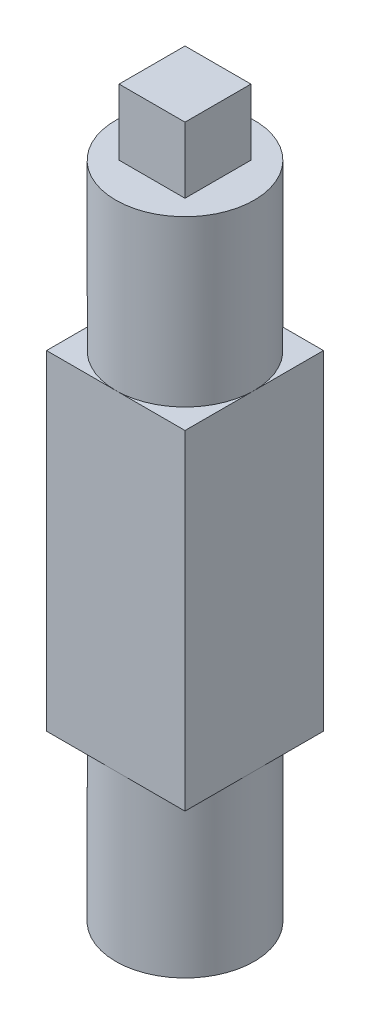
ISO-10303-21;
HEADER;
FILE_DESCRIPTION(('STEP AP214'),'2;1');
FILE_NAME('part.step','',(''),(''),'','','');
FILE_SCHEMA(('AUTOMOTIVE_DESIGN { 1 0 10303 214 1 1 1 1 }'));
ENDSEC;
DATA;
#1=APPLICATION_CONTEXT('core data for automotive mechanical design processes');
#2=APPLICATION_PROTOCOL_DEFINITION('international standard','automotive_design',2000,#1);
#3=PRODUCT_CONTEXT('',#1,'mechanical');
#4=PRODUCT('Part','Part','',(#3));
#5=PRODUCT_RELATED_PRODUCT_CATEGORY('part','',(#4));
#6=PRODUCT_DEFINITION_FORMATION('','',#4);
#7=PRODUCT_DEFINITION_CONTEXT('part definition',#1,'design');
#8=PRODUCT_DEFINITION('design','',#6,#7);
#9=PRODUCT_DEFINITION_SHAPE('','',#8);
#10=(LENGTH_UNIT() NAMED_UNIT(*) SI_UNIT(.MILLI.,.METRE.));
#11=(NAMED_UNIT(*) PLANE_ANGLE_UNIT() SI_UNIT($,.RADIAN.));
#12=(NAMED_UNIT(*) SI_UNIT($,.STERADIAN.) SOLID_ANGLE_UNIT());
#13=UNCERTAINTY_MEASURE_WITH_UNIT(LENGTH_MEASURE(1.E-05),#10,'distance_accuracy_value','');
#14=(GEOMETRIC_REPRESENTATION_CONTEXT(3) GLOBAL_UNCERTAINTY_ASSIGNED_CONTEXT((#13)) GLOBAL_UNIT_ASSIGNED_CONTEXT((#10,
#11,#12)) REPRESENTATION_CONTEXT('',''));
#15=CARTESIAN_POINT('',(0.,0.,0.));
#16=DIRECTION('',(0.,0.,1.));
#17=DIRECTION('',(1.,0.,0.));
#18=AXIS2_PLACEMENT_3D('',#15,#16,#17);
#19=CARTESIAN_POINT('',(0.,75.,0.));
#20=DIRECTION('',(0.,1.,0.));
#21=DIRECTION('',(0.,0.,1.));
#22=AXIS2_PLACEMENT_3D('',#19,#20,#21);
#23=PLANE('',#22);
#24=CARTESIAN_POINT('',(0.,75.,0.));
#25=DIRECTION('',(0.,1.,0.));
#26=DIRECTION('',(0.,0.,1.));
#27=AXIS2_PLACEMENT_3D('',#24,#25,#26);
#28=CIRCLE('',#27,10.5);
#29=CARTESIAN_POINT('',(0.,75.,10.5));
#30=VERTEX_POINT('',#29);
#31=CARTESIAN_POINT('',(10.5,75.,0.));
#32=VERTEX_POINT('',#31);
#33=EDGE_CURVE('E53',#30,#32,#28,.T.);
#34=ORIENTED_EDGE('',*,*,#33,.F.);
#35=DIRECTION('',(1.,0.,0.));
#36=VECTOR('',#35,1.);
#37=CARTESIAN_POINT('',(10.5,75.,10.5));
#38=LINE('',#37,#36);
#39=CARTESIAN_POINT('',(10.5,75.,10.5));
#40=VERTEX_POINT('',#39);
#41=EDGE_CURVE('E168',#30,#40,#38,.T.);
#42=ORIENTED_EDGE('',*,*,#41,.T.);
#43=DIRECTION('',(0.,0.,-1.));
#44=VECTOR('',#43,1.);
#45=CARTESIAN_POINT('',(10.5,75.,10.5));
#46=LINE('',#45,#44);
#47=EDGE_CURVE('E173',#40,#32,#46,.T.);
#48=ORIENTED_EDGE('',*,*,#47,.T.);
#49=EDGE_LOOP('',(#34,#42,#48));
#50=FACE_BOUND('',#49,.T.);
#51=ADVANCED_FACE('F37',(#50),#23,.T.);
#52=CARTESIAN_POINT('',(0.,75.,-10.5));
#53=VERTEX_POINT('',#52);
#54=EDGE_CURVE('E11',#32,#53,#28,.T.);
#55=ORIENTED_EDGE('',*,*,#54,.F.);
#56=CARTESIAN_POINT('',(10.5,75.,-10.5));
#57=VERTEX_POINT('',#56);
#58=EDGE_CURVE('E172',#32,#57,#46,.T.);
#59=ORIENTED_EDGE('',*,*,#58,.T.);
#60=DIRECTION('',(-1.,0.,0.));
#61=VECTOR('',#60,1.);
#62=CARTESIAN_POINT('',(10.5,75.,-10.5));
#63=LINE('',#62,#61);
#64=EDGE_CURVE('E177',#57,#53,#63,.T.);
#65=ORIENTED_EDGE('',*,*,#64,.T.);
#66=EDGE_LOOP('',(#55,#59,#65));
#67=FACE_BOUND('',#66,.T.);
#68=ADVANCED_FACE('F243',(#67),#23,.T.);
#69=CARTESIAN_POINT('',(-10.5,75.,0.));
#70=VERTEX_POINT('',#69);
#71=EDGE_CURVE('E51',#53,#70,#28,.T.);
#72=ORIENTED_EDGE('',*,*,#71,.F.);
#73=CARTESIAN_POINT('',(-10.5,75.,-10.5));
#74=VERTEX_POINT('',#73);
#75=EDGE_CURVE('E176',#53,#74,#63,.T.);
#76=ORIENTED_EDGE('',*,*,#75,.T.);
#77=DIRECTION('',(0.,0.,1.));
#78=VECTOR('',#77,1.);
#79=CARTESIAN_POINT('',(-10.5,75.,10.5));
#80=LINE('',#79,#78);
#81=EDGE_CURVE('E165',#74,#70,#80,.T.);
#82=ORIENTED_EDGE('',*,*,#81,.T.);
#83=EDGE_LOOP('',(#72,#76,#82));
#84=FACE_BOUND('',#83,.T.);
#85=ADVANCED_FACE('F250',(#84),#23,.T.);
#86=CARTESIAN_POINT('',(0.,25.,0.));
#87=DIRECTION('',(0.,-1.,0.));
#88=DIRECTION('',(0.,0.,-1.));
#89=AXIS2_PLACEMENT_3D('',#86,#87,#88);
#90=CYLINDRICAL_SURFACE('',#89,10.5);
#91=CARTESIAN_POINT('',(0.,25.,0.));
#92=DIRECTION('',(0.,1.,0.));
#93=DIRECTION('',(0.,0.,1.));
#94=AXIS2_PLACEMENT_3D('',#91,#92,#93);
#95=CIRCLE('',#94,10.5);
#96=CARTESIAN_POINT('',(0.,25.,10.5));
#97=VERTEX_POINT('',#96);
#98=CARTESIAN_POINT('',(10.5,25.,0.));
#99=VERTEX_POINT('',#98);
#100=EDGE_CURVE('E208',#97,#99,#95,.T.);
#101=ORIENTED_EDGE('',*,*,#100,.F.);
#102=CARTESIAN_POINT('',(-10.5,25.,0.));
#103=VERTEX_POINT('',#102);
#104=EDGE_CURVE('E212',#103,#97,#95,.T.);
#105=ORIENTED_EDGE('',*,*,#104,.F.);
#106=CARTESIAN_POINT('',(0.,25.,-10.5));
#107=VERTEX_POINT('',#106);
#108=EDGE_CURVE('E295',#107,#103,#95,.T.);
#109=ORIENTED_EDGE('',*,*,#108,.F.);
#110=EDGE_CURVE('E211',#99,#107,#95,.T.);
#111=ORIENTED_EDGE('',*,*,#110,.F.);
#112=EDGE_LOOP('',(#101,#105,#109,#111));
#113=FACE_BOUND('',#112,.T.);
#114=CARTESIAN_POINT('',(0.,0.,0.));
#115=DIRECTION('',(0.,1.,0.));
#116=DIRECTION('',(0.,0.,1.));
#117=AXIS2_PLACEMENT_3D('',#114,#115,#116);
#118=CIRCLE('',#117,10.5);
#119=CARTESIAN_POINT('',(0.,0.,10.5));
#120=VERTEX_POINT('',#119);
#121=EDGE_CURVE('E207',#120,#120,#118,.T.);
#122=ORIENTED_EDGE('',*,*,#121,.T.);
#123=EDGE_LOOP('',(#122));
#124=FACE_BOUND('',#123,.T.);
#125=ADVANCED_FACE('F39',(#113,#124),#90,.T.);
#126=CARTESIAN_POINT('',(0.,0.,0.));
#127=DIRECTION('',(0.,1.,0.));
#128=DIRECTION('',(0.,0.,1.));
#129=AXIS2_PLACEMENT_3D('',#126,#127,#128);
#130=PLANE('',#129);
#131=CARTESIAN_POINT('',(0.,0.,0.));
#132=DIRECTION('',(0.,-1.,0.));
#133=DIRECTION('',(0.,0.,-1.));
#134=AXIS2_PLACEMENT_3D('',#131,#132,#133);
#135=CIRCLE('',#134,6.5);
#136=CARTESIAN_POINT('',(0.,0.,-6.5));
#137=VERTEX_POINT('',#136);
#138=EDGE_CURVE('E572',#137,#137,#135,.T.);
#139=ORIENTED_EDGE('',*,*,#138,.F.);
#140=EDGE_LOOP('',(#139));
#141=FACE_BOUND('',#140,.T.);
#142=ORIENTED_EDGE('',*,*,#121,.F.);
#143=EDGE_LOOP('',(#142));
#144=FACE_BOUND('',#143,.T.);
#145=ADVANCED_FACE('F273',(#141,#144),#130,.F.);
#146=CARTESIAN_POINT('',(0.,25.,0.));
#147=DIRECTION('',(0.,1.,0.));
#148=DIRECTION('',(0.,0.,1.));
#149=AXIS2_PLACEMENT_3D('',#146,#147,#148);
#150=PLANE('',#149);
#151=DIRECTION('',(1.,0.,0.));
#152=VECTOR('',#151,1.);
#153=CARTESIAN_POINT('',(10.5,25.,10.5));
#154=LINE('',#153,#152);
#155=CARTESIAN_POINT('',(10.5,25.,10.5));
#156=VERTEX_POINT('',#155);
#157=EDGE_CURVE('E184',#97,#156,#154,.T.);
#158=ORIENTED_EDGE('',*,*,#157,.F.);
#159=ORIENTED_EDGE('',*,*,#100,.T.);
#160=DIRECTION('',(0.,0.,-1.));
#161=VECTOR('',#160,1.);
#162=CARTESIAN_POINT('',(10.5,25.,10.5));
#163=LINE('',#162,#161);
#164=EDGE_CURVE('E189',#156,#99,#163,.T.);
#165=ORIENTED_EDGE('',*,*,#164,.F.);
#166=EDGE_LOOP('',(#158,#159,#165));
#167=FACE_BOUND('',#166,.T.);
#168=ADVANCED_FACE('F311',(#167),#150,.F.);
#169=CARTESIAN_POINT('',(10.5,25.,-10.5));
#170=VERTEX_POINT('',#169);
#171=EDGE_CURVE('E188',#99,#170,#163,.T.);
#172=ORIENTED_EDGE('',*,*,#171,.F.);
#173=ORIENTED_EDGE('',*,*,#110,.T.);
#174=DIRECTION('',(-1.,0.,0.));
#175=VECTOR('',#174,1.);
#176=CARTESIAN_POINT('',(10.5,25.,-10.5));
#177=LINE('',#176,#175);
#178=EDGE_CURVE('E193',#170,#107,#177,.T.);
#179=ORIENTED_EDGE('',*,*,#178,.F.);
#180=EDGE_LOOP('',(#172,#173,#179));
#181=FACE_BOUND('',#180,.T.);
#182=ADVANCED_FACE('F293',(#181),#150,.F.);
#183=CARTESIAN_POINT('',(-10.5,25.,-10.5));
#184=VERTEX_POINT('',#183);
#185=EDGE_CURVE('E192',#107,#184,#177,.T.);
#186=ORIENTED_EDGE('',*,*,#185,.F.);
#187=ORIENTED_EDGE('',*,*,#108,.T.);
#188=DIRECTION('',(0.,0.,1.));
#189=VECTOR('',#188,1.);
#190=CARTESIAN_POINT('',(-10.5,25.,10.5));
#191=LINE('',#190,#189);
#192=EDGE_CURVE('E181',#184,#103,#191,.T.);
#193=ORIENTED_EDGE('',*,*,#192,.F.);
#194=EDGE_LOOP('',(#186,#187,#193));
#195=FACE_BOUND('',#194,.T.);
#196=ADVANCED_FACE('F299',(#195),#150,.F.);
#197=CARTESIAN_POINT('',(-10.5,25.,10.5));
#198=VERTEX_POINT('',#197);
#199=EDGE_CURVE('E163',#103,#198,#191,.T.);
#200=ORIENTED_EDGE('',*,*,#199,.F.);
#201=ORIENTED_EDGE('',*,*,#104,.T.);
#202=EDGE_CURVE('E185',#198,#97,#154,.T.);
#203=ORIENTED_EDGE('',*,*,#202,.F.);
#204=EDGE_LOOP('',(#200,#201,#203));
#205=FACE_BOUND('',#204,.T.);
#206=ADVANCED_FACE('F315',(#205),#150,.F.);
#207=CARTESIAN_POINT('',(-10.5,75.,10.5));
#208=DIRECTION('',(1.,0.,0.));
#209=DIRECTION('',(0.,0.,-1.));
#210=AXIS2_PLACEMENT_3D('',#207,#208,#209);
#211=PLANE('',#210);
#212=CARTESIAN_POINT('',(-10.5,56.2030928561839,0.));
#213=DIRECTION('',(-1.,0.,0.));
#214=DIRECTION('',(0.,0.,1.));
#215=AXIS2_PLACEMENT_3D('',#212,#213,#214);
#216=CIRCLE('',#215,4.);
#217=CARTESIAN_POINT('',(-10.5,56.2030928561839,4.));
#218=VERTEX_POINT('',#217);
#219=EDGE_CURVE('E552',#218,#218,#216,.T.);
#220=ORIENTED_EDGE('',*,*,#219,.F.);
#221=EDGE_LOOP('',(#220));
#222=FACE_BOUND('',#221,.T.);
#223=ORIENTED_EDGE('',*,*,#192,.T.);
#224=ORIENTED_EDGE('',*,*,#199,.T.);
#225=DIRECTION('',(0.,-1.,0.));
#226=VECTOR('',#225,1.);
#227=CARTESIAN_POINT('',(-10.5,75.,10.5));
#228=LINE('',#227,#226);
#229=CARTESIAN_POINT('',(-10.5,75.,10.5));
#230=VERTEX_POINT('',#229);
#231=EDGE_CURVE('E204',#230,#198,#228,.T.);
#232=ORIENTED_EDGE('',*,*,#231,.F.);
#233=EDGE_CURVE('E169',#70,#230,#80,.T.);
#234=ORIENTED_EDGE('',*,*,#233,.F.);
#235=ORIENTED_EDGE('',*,*,#81,.F.);
#236=DIRECTION('',(0.,-1.,0.));
#237=VECTOR('',#236,1.);
#238=CARTESIAN_POINT('',(-10.5,75.,-10.5));
#239=LINE('',#238,#237);
#240=EDGE_CURVE('E180',#74,#184,#239,.T.);
#241=ORIENTED_EDGE('',*,*,#240,.T.);
#242=EDGE_LOOP('',(#223,#224,#232,#234,#235,#241));
#243=FACE_BOUND('',#242,.T.);
#244=ADVANCED_FACE('F302',(#222,#243),#211,.F.);
#245=CARTESIAN_POINT('',(10.5,75.,10.5));
#246=DIRECTION('',(0.,0.,-1.));
#247=DIRECTION('',(-1.,0.,0.));
#248=AXIS2_PLACEMENT_3D('',#245,#246,#247);
#249=PLANE('',#248);
#250=ORIENTED_EDGE('',*,*,#202,.T.);
#251=ORIENTED_EDGE('',*,*,#157,.T.);
#252=DIRECTION('',(0.,-1.,0.));
#253=VECTOR('',#252,1.);
#254=CARTESIAN_POINT('',(10.5,75.,10.5));
#255=LINE('',#254,#253);
#256=EDGE_CURVE('E201',#40,#156,#255,.T.);
#257=ORIENTED_EDGE('',*,*,#256,.F.);
#258=ORIENTED_EDGE('',*,*,#41,.F.);
#259=EDGE_CURVE('E170',#230,#30,#38,.T.);
#260=ORIENTED_EDGE('',*,*,#259,.F.);
#261=ORIENTED_EDGE('',*,*,#231,.T.);
#262=EDGE_LOOP('',(#250,#251,#257,#258,#260,#261));
#263=FACE_BOUND('',#262,.T.);
#264=ADVANCED_FACE('F307',(#263),#249,.F.);
#265=CARTESIAN_POINT('',(10.5,75.,10.5));
#266=DIRECTION('',(-1.,0.,0.));
#267=DIRECTION('',(0.,0.,1.));
#268=AXIS2_PLACEMENT_3D('',#265,#266,#267);
#269=PLANE('',#268);
#270=ORIENTED_EDGE('',*,*,#164,.T.);
#271=ORIENTED_EDGE('',*,*,#171,.T.);
#272=DIRECTION('',(0.,-1.,0.));
#273=VECTOR('',#272,1.);
#274=CARTESIAN_POINT('',(10.5,75.,-10.5));
#275=LINE('',#274,#273);
#276=EDGE_CURVE('E198',#57,#170,#275,.T.);
#277=ORIENTED_EDGE('',*,*,#276,.F.);
#278=ORIENTED_EDGE('',*,*,#58,.F.);
#279=ORIENTED_EDGE('',*,*,#47,.F.);
#280=ORIENTED_EDGE('',*,*,#256,.T.);
#281=EDGE_LOOP('',(#270,#271,#277,#278,#279,#280));
#282=FACE_BOUND('',#281,.T.);
#283=ADVANCED_FACE('F265',(#282),#269,.F.);
#284=CARTESIAN_POINT('',(10.5,75.,-10.5));
#285=DIRECTION('',(0.,0.,1.));
#286=DIRECTION('',(1.,0.,0.));
#287=AXIS2_PLACEMENT_3D('',#284,#285,#286);
#288=PLANE('',#287);
#289=ORIENTED_EDGE('',*,*,#178,.T.);
#290=ORIENTED_EDGE('',*,*,#185,.T.);
#291=ORIENTED_EDGE('',*,*,#240,.F.);
#292=ORIENTED_EDGE('',*,*,#75,.F.);
#293=ORIENTED_EDGE('',*,*,#64,.F.);
#294=ORIENTED_EDGE('',*,*,#276,.T.);
#295=EDGE_LOOP('',(#289,#290,#291,#292,#293,#294));
#296=FACE_BOUND('',#295,.T.);
#297=ADVANCED_FACE('F257',(#296),#288,.F.);
#298=EDGE_CURVE('E157',#70,#30,#28,.T.);
#299=ORIENTED_EDGE('',*,*,#298,.F.);
#300=ORIENTED_EDGE('',*,*,#233,.T.);
#301=ORIENTED_EDGE('',*,*,#259,.T.);
#302=EDGE_LOOP('',(#299,#300,#301));
#303=FACE_BOUND('',#302,.T.);
#304=ADVANCED_FACE('F246',(#303),#23,.T.);
#305=CARTESIAN_POINT('',(0.,100.,0.));
#306=DIRECTION('',(0.,-1.,0.));
#307=DIRECTION('',(0.,0.,-1.));
#308=AXIS2_PLACEMENT_3D('',#305,#306,#307);
#309=CYLINDRICAL_SURFACE('',#308,10.5);
#310=CARTESIAN_POINT('',(0.,100.,0.));
#311=DIRECTION('',(0.,1.,0.));
#312=DIRECTION('',(0.,0.,1.));
#313=AXIS2_PLACEMENT_3D('',#310,#311,#312);
#314=CIRCLE('',#313,10.5);
#315=CARTESIAN_POINT('',(0.,100.,10.5));
#316=VERTEX_POINT('',#315);
#317=EDGE_CURVE('E156',#316,#316,#314,.T.);
#318=ORIENTED_EDGE('',*,*,#317,.F.);
#319=EDGE_LOOP('',(#318));
#320=FACE_BOUND('',#319,.T.);
#321=ORIENTED_EDGE('',*,*,#33,.T.);
#322=ORIENTED_EDGE('',*,*,#54,.T.);
#323=ORIENTED_EDGE('',*,*,#71,.T.);
#324=ORIENTED_EDGE('',*,*,#298,.T.);
#325=EDGE_LOOP('',(#321,#322,#323,#324));
#326=FACE_BOUND('',#325,.T.);
#327=ADVANCED_FACE('F256',(#320,#326),#309,.T.);
#328=CARTESIAN_POINT('',(0.,100.,0.));
#329=DIRECTION('',(0.,1.,0.));
#330=DIRECTION('',(0.,0.,1.));
#331=AXIS2_PLACEMENT_3D('',#328,#329,#330);
#332=PLANE('',#331);
#333=DIRECTION('',(0.,0.,-1.));
#334=VECTOR('',#333,1.);
#335=CARTESIAN_POINT('',(5.,100.,-5.));
#336=LINE('',#335,#334);
#337=CARTESIAN_POINT('',(5.,100.,5.));
#338=VERTEX_POINT('',#337);
#339=CARTESIAN_POINT('',(5.,100.,-5.));
#340=VERTEX_POINT('',#339);
#341=EDGE_CURVE('E60',#338,#340,#336,.T.);
#342=ORIENTED_EDGE('',*,*,#341,.F.);
#343=DIRECTION('',(1.,0.,0.));
#344=VECTOR('',#343,1.);
#345=CARTESIAN_POINT('',(-5.,100.,5.));
#346=LINE('',#345,#344);
#347=CARTESIAN_POINT('',(-5.,100.,5.));
#348=VERTEX_POINT('',#347);
#349=EDGE_CURVE('E64',#348,#338,#346,.T.);
#350=ORIENTED_EDGE('',*,*,#349,.F.);
#351=DIRECTION('',(0.,0.,1.));
#352=VECTOR('',#351,1.);
#353=CARTESIAN_POINT('',(-5.,100.,-5.));
#354=LINE('',#353,#352);
#355=CARTESIAN_POINT('',(-5.,100.,-5.));
#356=VERTEX_POINT('',#355);
#357=EDGE_CURVE('E565',#356,#348,#354,.T.);
#358=ORIENTED_EDGE('',*,*,#357,.F.);
#359=DIRECTION('',(-1.,0.,0.));
#360=VECTOR('',#359,1.);
#361=CARTESIAN_POINT('',(-5.,100.,-5.));
#362=LINE('',#361,#360);
#363=EDGE_CURVE('E563',#340,#356,#362,.T.);
#364=ORIENTED_EDGE('',*,*,#363,.F.);
#365=EDGE_LOOP('',(#342,#350,#358,#364));
#366=FACE_BOUND('',#365,.T.);
#367=ORIENTED_EDGE('',*,*,#317,.T.);
#368=EDGE_LOOP('',(#367));
#369=FACE_BOUND('',#368,.T.);
#370=ADVANCED_FACE('F263',(#366,#369),#332,.T.);
#371=CARTESIAN_POINT('',(5.,110.,-5.));
#372=DIRECTION('',(-1.,0.,0.));
#373=DIRECTION('',(0.,0.,1.));
#374=AXIS2_PLACEMENT_3D('',#371,#372,#373);
#375=PLANE('',#374);
#376=ORIENTED_EDGE('',*,*,#341,.T.);
#377=DIRECTION('',(0.,-1.,0.));
#378=VECTOR('',#377,1.);
#379=CARTESIAN_POINT('',(5.,110.,-5.));
#380=LINE('',#379,#378);
#381=CARTESIAN_POINT('',(5.,110.,-5.));
#382=VERTEX_POINT('',#381);
#383=EDGE_CURVE('E137',#382,#340,#380,.T.);
#384=ORIENTED_EDGE('',*,*,#383,.F.);
#385=DIRECTION('',(0.,0.,-1.));
#386=VECTOR('',#385,1.);
#387=CARTESIAN_POINT('',(5.,110.,-5.));
#388=LINE('',#387,#386);
#389=CARTESIAN_POINT('',(5.,110.,5.));
#390=VERTEX_POINT('',#389);
#391=EDGE_CURVE('E143',#390,#382,#388,.T.);
#392=ORIENTED_EDGE('',*,*,#391,.F.);
#393=DIRECTION('',(0.,-1.,0.));
#394=VECTOR('',#393,1.);
#395=CARTESIAN_POINT('',(5.,110.,5.));
#396=LINE('',#395,#394);
#397=EDGE_CURVE('E561',#390,#338,#396,.T.);
#398=ORIENTED_EDGE('',*,*,#397,.T.);
#399=EDGE_LOOP('',(#376,#384,#392,#398));
#400=FACE_BOUND('',#399,.T.);
#401=ADVANCED_FACE('F153',(#400),#375,.F.);
#402=CARTESIAN_POINT('',(-5.,110.,-5.));
#403=DIRECTION('',(0.,0.,1.));
#404=DIRECTION('',(1.,0.,0.));
#405=AXIS2_PLACEMENT_3D('',#402,#403,#404);
#406=PLANE('',#405);
#407=ORIENTED_EDGE('',*,*,#363,.T.);
#408=DIRECTION('',(0.,-1.,0.));
#409=VECTOR('',#408,1.);
#410=CARTESIAN_POINT('',(-5.,110.,-5.));
#411=LINE('',#410,#409);
#412=CARTESIAN_POINT('',(-5.,110.,-5.));
#413=VERTEX_POINT('',#412);
#414=EDGE_CURVE('E139',#413,#356,#411,.T.);
#415=ORIENTED_EDGE('',*,*,#414,.F.);
#416=DIRECTION('',(-1.,0.,0.));
#417=VECTOR('',#416,1.);
#418=CARTESIAN_POINT('',(-5.,110.,-5.));
#419=LINE('',#418,#417);
#420=EDGE_CURVE('E132',#382,#413,#419,.T.);
#421=ORIENTED_EDGE('',*,*,#420,.F.);
#422=ORIENTED_EDGE('',*,*,#383,.T.);
#423=EDGE_LOOP('',(#407,#415,#421,#422));
#424=FACE_BOUND('',#423,.T.);
#425=ADVANCED_FACE('F135',(#424),#406,.F.);
#426=CARTESIAN_POINT('',(-5.,110.,-5.));
#427=DIRECTION('',(1.,0.,0.));
#428=DIRECTION('',(0.,0.,-1.));
#429=AXIS2_PLACEMENT_3D('',#426,#427,#428);
#430=PLANE('',#429);
#431=ORIENTED_EDGE('',*,*,#357,.T.);
#432=DIRECTION('',(0.,-1.,0.));
#433=VECTOR('',#432,1.);
#434=CARTESIAN_POINT('',(-5.,110.,5.));
#435=LINE('',#434,#433);
#436=CARTESIAN_POINT('',(-5.,110.,5.));
#437=VERTEX_POINT('',#436);
#438=EDGE_CURVE('E158',#437,#348,#435,.T.);
#439=ORIENTED_EDGE('',*,*,#438,.F.);
#440=DIRECTION('',(0.,0.,1.));
#441=VECTOR('',#440,1.);
#442=CARTESIAN_POINT('',(-5.,110.,-5.));
#443=LINE('',#442,#441);
#444=EDGE_CURVE('E142',#413,#437,#443,.T.);
#445=ORIENTED_EDGE('',*,*,#444,.F.);
#446=ORIENTED_EDGE('',*,*,#414,.T.);
#447=EDGE_LOOP('',(#431,#439,#445,#446));
#448=FACE_BOUND('',#447,.T.);
#449=ADVANCED_FACE('F387',(#448),#430,.F.);
#450=CARTESIAN_POINT('',(-5.,110.,5.));
#451=DIRECTION('',(0.,0.,-1.));
#452=DIRECTION('',(-1.,0.,0.));
#453=AXIS2_PLACEMENT_3D('',#450,#451,#452);
#454=PLANE('',#453);
#455=ORIENTED_EDGE('',*,*,#349,.T.);
#456=ORIENTED_EDGE('',*,*,#397,.F.);
#457=DIRECTION('',(1.,0.,0.));
#458=VECTOR('',#457,1.);
#459=CARTESIAN_POINT('',(-5.,110.,5.));
#460=LINE('',#459,#458);
#461=EDGE_CURVE('E148',#437,#390,#460,.T.);
#462=ORIENTED_EDGE('',*,*,#461,.F.);
#463=ORIENTED_EDGE('',*,*,#438,.T.);
#464=EDGE_LOOP('',(#455,#456,#462,#463));
#465=FACE_BOUND('',#464,.T.);
#466=ADVANCED_FACE('F397',(#465),#454,.F.);
#467=CARTESIAN_POINT('',(0.,110.,0.));
#468=DIRECTION('',(0.,1.,0.));
#469=DIRECTION('',(0.,0.,1.));
#470=AXIS2_PLACEMENT_3D('',#467,#468,#469);
#471=PLANE('',#470);
#472=ORIENTED_EDGE('',*,*,#391,.T.);
#473=ORIENTED_EDGE('',*,*,#420,.T.);
#474=ORIENTED_EDGE('',*,*,#444,.T.);
#475=ORIENTED_EDGE('',*,*,#461,.T.);
#476=EDGE_LOOP('',(#472,#473,#474,#475));
#477=FACE_BOUND('',#476,.T.);
#478=ADVANCED_FACE('F146',(#477),#471,.T.);
#479=CARTESIAN_POINT('',(7.5,56.2030928561839,0.));
#480=DIRECTION('',(-1.,0.,0.));
#481=DIRECTION('',(0.,0.,1.));
#482=AXIS2_PLACEMENT_3D('',#479,#480,#481);
#483=CYLINDRICAL_SURFACE('',#482,4.);
#484=CARTESIAN_POINT('',(-5.1234753829798,56.2030928561839,4.));
#485=CARTESIAN_POINT('',(-5.12347713657616,56.10324955332,3.99999887511368));
#486=CARTESIAN_POINT('',(-5.12640682483417,56.0033786467201,3.99625399732967));
#487=CARTESIAN_POINT('',(-5.13799719570292,55.8044844932012,3.98134025862972));
#488=CARTESIAN_POINT('',(-5.1466615873077,55.7054618369115,3.97016659302751));
#489=CARTESIAN_POINT('',(-5.16936573069826,55.5089102744308,3.9405590608807));
#490=CARTESIAN_POINT('',(-5.18341719303693,55.4113851072791,3.92210937501391));
#491=CARTESIAN_POINT('',(-5.21631619694594,55.2187221733228,3.87824609249435));
#492=CARTESIAN_POINT('',(-5.2351661198617,55.123585617751,3.85282903764331));
#493=CARTESIAN_POINT('',(-5.2975118930577,54.8443078177555,3.76713981429484));
#494=CARTESIAN_POINT('',(-5.34704541637303,54.6644051307186,3.69713461531885));
#495=CARTESIAN_POINT('',(-5.45637608486704,54.3192207026518,3.53377707470374));
#496=CARTESIAN_POINT('',(-5.51617292067096,54.1539385211327,3.44042543677516));
#497=CARTESIAN_POINT('',(-5.6486519372425,53.8190019218335,3.21892377258575));
#498=CARTESIAN_POINT('',(-5.72199980218117,53.6515554853992,3.08783223309545));
#499=CARTESIAN_POINT('',(-5.86799191617871,53.3391055063366,2.80046904719544));
#500=CARTESIAN_POINT('',(-5.94063551475959,53.1941211449764,2.64417611016676));
#501=CARTESIAN_POINT('',(-6.0483243275859,52.9881038282925,2.38286990663015));
#502=CARTESIAN_POINT('',(-6.08580938951634,52.9182669807567,2.28568158855732));
#503=CARTESIAN_POINT('',(-6.15757848162021,52.7871317213246,2.08461055875056));
#504=CARTESIAN_POINT('',(-6.19186384772521,52.7258297406595,1.98073067176673));
#505=CARTESIAN_POINT('',(-6.2562444343275,52.6124425730208,1.76688192807704));
#506=CARTESIAN_POINT('',(-6.28634164261803,52.5603530104253,1.65691599482345));
#507=CARTESIAN_POINT('',(-6.34144803942563,52.4660581624784,1.43159946565468));
#508=CARTESIAN_POINT('',(-6.36645811806669,52.4238511477258,1.31624981610915));
#509=CARTESIAN_POINT('',(-6.40838703250716,52.3536598681407,1.09278967074767));
#510=CARTESIAN_POINT('',(-6.42586235547201,52.3246801420343,0.985095920594979));
#511=CARTESIAN_POINT('',(-6.45552932860006,52.2757223477537,0.766973793679366));
#512=CARTESIAN_POINT('',(-6.46772182283343,52.2557428415384,0.656545856757165));
#513=CARTESIAN_POINT('',(-6.48645425113834,52.2251240924583,0.434014676552619));
#514=CARTESIAN_POINT('',(-6.49299865161971,52.2144774692144,0.321912828470643));
#515=CARTESIAN_POINT('',(-6.50024913730255,52.2026852675802,0.0970285709890167));
#516=CARTESIAN_POINT('',(-6.50095586344691,52.2015386461445,-0.0157537623365432));
#517=CARTESIAN_POINT('',(-6.49680097681437,52.2082926945523,-0.226182592153619));
#518=CARTESIAN_POINT('',(-6.49265447843572,52.2150314371297,-0.323882323128414));
#519=CARTESIAN_POINT('',(-6.48003989038484,52.235602805768,-0.518258298369308));
#520=CARTESIAN_POINT('',(-6.47157050163652,52.2494375642659,-0.614934226051797));
#521=CARTESIAN_POINT('',(-6.43993788468158,52.3013498353232,-0.902326020411395));
#522=CARTESIAN_POINT('',(-6.41054580962105,52.3498420503661,-1.09060145777752));
#523=CARTESIAN_POINT('',(-6.33753263883013,52.472577842377,-1.45625882265054));
#524=CARTESIAN_POINT('',(-6.29385686120839,52.5469204519535,-1.63359572328175));
#525=CARTESIAN_POINT('',(-6.19570063444803,52.7186037761612,-1.9734742197741));
#526=CARTESIAN_POINT('',(-6.14121759534825,52.8159500046837,-2.13601225543652));
#527=CARTESIAN_POINT('',(-6.01811329340775,53.0442860248484,-2.46301792903409));
#528=CARTESIAN_POINT('',(-5.94857761116338,53.1779372625278,-2.62527932595506));
#529=CARTESIAN_POINT('',(-5.80633337570436,53.4682196022893,-2.92648326267955));
#530=CARTESIAN_POINT('',(-5.73362042679609,53.6248832974537,-3.06539211925788));
#531=CARTESIAN_POINT('',(-5.58247201496418,53.9798105502089,-3.33354274624901));
#532=CARTESIAN_POINT('',(-5.50445614718878,54.1808259782625,-3.45941006662978));
#533=CARTESIAN_POINT('',(-5.36292828124606,54.6059612380331,-3.67501039724317));
#534=CARTESIAN_POINT('',(-5.29938954688106,54.8300373516208,-3.76481025437048));
#535=CARTESIAN_POINT('',(-5.2111969568149,55.2360917644402,-3.88555185537444));
#536=CARTESIAN_POINT('',(-5.18074475085953,55.4140702798468,-3.92569222311964));
#537=CARTESIAN_POINT('',(-5.13813041921935,55.7758978753792,-3.98131827949251));
#538=CARTESIAN_POINT('',(-5.12594478044201,55.9597390968803,-3.99683566482825));
#539=CARTESIAN_POINT('',(-5.12168600082458,56.3283926572449,-4.00229325003938));
#540=CARTESIAN_POINT('',(-5.12965141888962,56.5132061815947,-3.99218441424513));
#541=CARTESIAN_POINT('',(-5.16453073692964,56.8779599447115,-3.9469473814774));
#542=CARTESIAN_POINT('',(-5.19146010573793,57.0578960804905,-3.9117987593589));
#543=CARTESIAN_POINT('',(-5.26018225750345,57.4066455769126,-3.81886572423089));
#544=CARTESIAN_POINT('',(-5.30181972845391,57.5755541054622,-3.76131722200471));
#545=CARTESIAN_POINT('',(-5.3954670297872,57.9017786280099,-3.62570220427766));
#546=CARTESIAN_POINT('',(-5.44748061653257,58.0590903954188,-3.54762825488917));
#547=CARTESIAN_POINT('',(-5.56773730356901,58.3888431877168,-3.35638015591539));
#548=CARTESIAN_POINT('',(-5.6371970970822,58.5586210107212,-3.23937361019164));
#549=CARTESIAN_POINT('',(-5.7779144213707,58.8779494781105,-2.98117533428058));
#550=CARTESIAN_POINT('',(-5.84917370734001,59.0274793915443,-2.83995914704197));
#551=CARTESIAN_POINT('',(-5.99792993480129,59.3246447627804,-2.51230294955814));
#552=CARTESIAN_POINT('',(-6.07478576966285,59.4687139273129,-2.32226223380833));
#553=CARTESIAN_POINT('',(-6.17981341127997,59.6589355649869,-2.01780081268138));
#554=CARTESIAN_POINT('',(-6.21312570303109,59.718049452039,-1.91302977376878));
#555=CARTESIAN_POINT('',(-6.27541066154967,59.8270115580475,-1.69757398668656));
#556=CARTESIAN_POINT('',(-6.30438605831685,59.8768656107114,-1.58689301876127));
#557=CARTESIAN_POINT('',(-6.35540596966367,59.9637225765415,-1.36771717286114));
#558=CARTESIAN_POINT('',(-6.37777789582193,60.0013488224164,-1.25954523414218));
#559=CARTESIAN_POINT('',(-6.41730693921316,60.0673557926369,-1.0395424276752));
#560=CARTESIAN_POINT('',(-6.43446703905276,60.0957418056224,-0.927713693370161));
#561=CARTESIAN_POINT('',(-6.46305144652246,60.1428115619159,-0.70140168691385));
#562=CARTESIAN_POINT('',(-6.47448031829465,60.1615030260189,-0.58692060325831));
#563=CARTESIAN_POINT('',(-6.49125430740733,60.1888802155943,-0.356332076611583));
#564=CARTESIAN_POINT('',(-6.49660034488408,60.1975674543851,-0.24022488228897));
#565=CARTESIAN_POINT('',(-6.50072100810798,60.204264787696,-0.0241800032833929));
#566=CARTESIAN_POINT('',(-6.50032377647171,60.2036204158872,0.0757032145151782));
#567=CARTESIAN_POINT('',(-6.49494349113715,60.1948723073999,0.27505117774269));
#568=CARTESIAN_POINT('',(-6.48995903188888,60.1867662844331,0.374515785523161));
#569=CARTESIAN_POINT('',(-6.47552310051639,60.1632048557722,0.572201216464004));
#570=CARTESIAN_POINT('',(-6.46607350299796,60.1477525342691,0.670422543840654));
#571=CARTESIAN_POINT('',(-6.44293674493903,60.1097098626287,0.864977871596926));
#572=CARTESIAN_POINT('',(-6.42924794861747,60.0871167570053,0.961311128142403));
#573=CARTESIAN_POINT('',(-6.38312478202401,60.0104484725767,1.24124770417761));
#574=CARTESIAN_POINT('',(-6.34519014963781,59.9467829939158,1.42142818690046));
#575=CARTESIAN_POINT('',(-6.25739870433962,59.7959717950051,1.76836086933044));
#576=CARTESIAN_POINT('',(-6.20753967818403,59.7088217154824,1.93511056850881));
#577=CARTESIAN_POINT('',(-6.09366985599603,59.5032316538095,2.26971440354609));
#578=CARTESIAN_POINT('',(-6.02871907904727,59.3824537690492,2.43581096412528));
#579=CARTESIAN_POINT('',(-5.89363170045022,59.1181923886361,2.74661627133292));
#580=CARTESIAN_POINT('',(-5.82348918099978,58.9746827631193,2.89130002938076));
#581=CARTESIAN_POINT('',(-5.67394446001722,58.6460356724433,3.17577814197269));
#582=CARTESIAN_POINT('',(-5.59459938435395,58.4578867301595,3.31214609552206));
#583=CARTESIAN_POINT('',(-5.44573530175625,58.057920631607,3.5515999648683));
#584=CARTESIAN_POINT('',(-5.37620966590185,57.8461196170467,3.65470839450382));
#585=CARTESIAN_POINT('',(-5.27084090224943,57.4517851469061,3.80456746957854));
#586=CARTESIAN_POINT('',(-5.23094618875543,57.2732059018638,3.85875009839216));
#587=CARTESIAN_POINT('',(-5.18416897638833,56.9991697996227,3.92110216574551));
#588=CARTESIAN_POINT('',(-5.17076120978012,56.9068954812085,3.9387240346589));
#589=CARTESIAN_POINT('',(-5.1487383288086,56.7207937105988,3.96747159089492));
#590=CARTESIAN_POINT('',(-5.14012053111059,56.6269671583624,3.97860091550645));
#591=CARTESIAN_POINT('',(-5.13055281063194,56.4779835493844,3.99092178272306));
#592=CARTESIAN_POINT('',(-5.12790291115791,56.423104017453,3.99432349889887));
#593=CARTESIAN_POINT('',(-5.12436353114302,56.3131834269974,3.99886315266007));
#594=CARTESIAN_POINT('',(-5.12347441611905,56.2581423373102,4.00000062021594));
#595=CARTESIAN_POINT('',(-5.1234753829798,56.2030928561839,4.));
#596=B_SPLINE_CURVE_WITH_KNOTS('',3,(#484,#485,#486,#487,#488,#489,#490,#491,#492,#493,#494,
#495,#496,#497,#498,#499,#500,#501,#502,#503,#504,#505,#506,#507,#508,#509,#510,#511,#512,#513,
#514,#515,#516,#517,#518,#519,#520,#521,#522,#523,#524,#525,#526,#527,#528,#529,#530,#531,#532,
#533,#534,#535,#536,#537,#538,#539,#540,#541,#542,#543,#544,#545,#546,#547,#548,#549,#550,#551,
#552,#553,#554,#555,#556,#557,#558,#559,#560,#561,#562,#563,#564,#565,#566,#567,#568,#569,#570,
#571,#572,#573,#574,#575,#576,#577,#578,#579,#580,#581,#582,#583,#584,#585,#586,#587,#588,#589,
#590,#591,#592,#593,#594,#595),.UNSPECIFIED.,.T.,.F.,(4,2,2,2,2,2,2,2,2,2,2,2,2,2,2,2,2,2,2,2,2,
2,2,2,2,2,2,2,2,2,2,2,2,2,2,2,2,2,2,2,2,2,2,2,2,2,2,2,2,2,2,2,2,2,2,4),(0.,0.299465847023183,
0.599125566991792,0.899440422782909,1.1999046082103,1.79511322524675,2.39030390361143,
3.06260834820437,3.73548377320048,4.11128507027529,4.48692875482605,4.86239353791694,
5.23779256717747,5.5759578835789,5.91406914927767,6.25191279710496,6.58971935115932,
6.88341191371048,7.17719278611444,7.76417492115995,8.35343101568564,8.94282849646918,
9.60448206829833,10.2670819563898,11.0124413384164,11.7564128362636,12.3089912060134,
12.8608576731458,13.413780931277,13.9671557303272,14.5148536725638,15.0627502534703,
15.7129948273108,16.3639002039921,17.1112891013322,17.4853137026704,17.8591018628049,
18.2086733445076,18.5580443960154,18.9071367774896,19.2561763455443,19.5554587988362,
19.8548329843429,20.1540815946503,20.4534458203018,21.0352824358616,21.6172271279354,
22.2608757283334,22.9052696372282,23.6385367813605,24.3713065199459,24.9412520597774,
25.2256353387176,25.5098591455138,25.6749380032628,25.840051125734),.UNSPECIFIED.);
#597=CARTESIAN_POINT('',(-5.1234753829798,56.2030928561839,4.));
#598=VERTEX_POINT('',#597);
#599=EDGE_CURVE('E214',#598,#598,#596,.T.);
#600=ORIENTED_EDGE('',*,*,#599,.T.);
#601=EDGE_LOOP('',(#600));
#602=FACE_BOUND('',#601,.T.);
#603=ORIENTED_EDGE('',*,*,#219,.T.);
#604=EDGE_LOOP('',(#603));
#605=FACE_BOUND('',#604,.T.);
#606=ADVANCED_FACE('F220',(#602,#605),#483,.F.);
#607=CARTESIAN_POINT('',(0.,65.,0.));
#608=DIRECTION('',(0.,-1.,0.));
#609=DIRECTION('',(0.,0.,-1.));
#610=AXIS2_PLACEMENT_3D('',#607,#608,#609);
#611=CYLINDRICAL_SURFACE('',#610,6.5);
#612=ORIENTED_EDGE('',*,*,#599,.F.);
#613=EDGE_LOOP('',(#612));
#614=FACE_BOUND('',#613,.T.);
#615=CARTESIAN_POINT('',(0.,65.,0.));
#616=DIRECTION('',(0.,-1.,0.));
#617=DIRECTION('',(0.,0.,-1.));
#618=AXIS2_PLACEMENT_3D('',#615,#616,#617);
#619=CIRCLE('',#618,6.5);
#620=CARTESIAN_POINT('',(0.,65.,-6.5));
#621=VERTEX_POINT('',#620);
#622=EDGE_CURVE('E219',#621,#621,#619,.T.);
#623=ORIENTED_EDGE('',*,*,#622,.F.);
#624=EDGE_LOOP('',(#623));
#625=FACE_BOUND('',#624,.T.);
#626=ORIENTED_EDGE('',*,*,#138,.T.);
#627=EDGE_LOOP('',(#626));
#628=FACE_BOUND('',#627,.T.);
#629=CARTESIAN_POINT('',(5.1234753829798,56.2030928561839,4.));
#630=CARTESIAN_POINT('',(5.12347713657616,56.3029361590477,3.99999887511368));
#631=CARTESIAN_POINT('',(5.12640682483417,56.4028070656476,3.99625399732967));
#632=CARTESIAN_POINT('',(5.13799719570292,56.6017012191666,3.98134025862972));
#633=CARTESIAN_POINT('',(5.1466615873077,56.7007238754562,3.97016659302751));
#634=CARTESIAN_POINT('',(5.16936573069826,56.8972754379369,3.9405590608807));
#635=CARTESIAN_POINT('',(5.18341719303693,56.9948006050886,3.9221093750139));
#636=CARTESIAN_POINT('',(5.21631619694594,57.1874635390449,3.87824609249434));
#637=CARTESIAN_POINT('',(5.2351661198617,57.2826000946168,3.85282903764331));
#638=CARTESIAN_POINT('',(5.2975118930577,57.5618778946122,3.76713981429484));
#639=CARTESIAN_POINT('',(5.34704541637303,57.7417805816492,3.69713461531885));
#640=CARTESIAN_POINT('',(5.45637608486704,58.0869650097159,3.53377707470374));
#641=CARTESIAN_POINT('',(5.51617292067096,58.2522471912351,3.44042543677516));
#642=CARTESIAN_POINT('',(5.6486519372425,58.5871837905342,3.21892377258575));
#643=CARTESIAN_POINT('',(5.72199980218117,58.7546302269685,3.08783223309545));
#644=CARTESIAN_POINT('',(5.86799191617871,59.0670802060312,2.80046904719544));
#645=CARTESIAN_POINT('',(5.94063551475959,59.2120645673913,2.64417611016676));
#646=CARTESIAN_POINT('',(6.0483243275859,59.4180818840752,2.38286990663015));
#647=CARTESIAN_POINT('',(6.08580938951633,59.487918731611,2.28568158855732));
#648=CARTESIAN_POINT('',(6.15757848162021,59.6190539910431,2.08461055875056));
#649=CARTESIAN_POINT('',(6.1918638477252,59.6803559717082,1.98073067176673));
#650=CARTESIAN_POINT('',(6.2562444343275,59.7937431393469,1.76688192807704));
#651=CARTESIAN_POINT('',(6.28634164261803,59.8458327019425,1.65691599482346));
#652=CARTESIAN_POINT('',(6.34144803942563,59.9401275498894,1.43159946565468));
#653=CARTESIAN_POINT('',(6.36645811806669,59.982334564642,1.31624981610915));
#654=CARTESIAN_POINT('',(6.40838703250716,60.0525258442271,1.09278967074767));
#655=CARTESIAN_POINT('',(6.42586235547201,60.0815055703334,0.985095920594979));
#656=CARTESIAN_POINT('',(6.45552932860006,60.1304633646141,0.766973793679365));
#657=CARTESIAN_POINT('',(6.46772182283343,60.1504428708293,0.656545856757165));
#658=CARTESIAN_POINT('',(6.48645425113834,60.1810616199095,0.434014676552619));
#659=CARTESIAN_POINT('',(6.49299865161971,60.1917082431533,0.321912828470643));
#660=CARTESIAN_POINT('',(6.50024913730255,60.2035004447876,0.0970285709890169));
#661=CARTESIAN_POINT('',(6.50095586344691,60.2046470662233,-0.015753762336543));
#662=CARTESIAN_POINT('',(6.49680097681437,60.1978930178154,-0.226182592153619));
#663=CARTESIAN_POINT('',(6.49265447843572,60.191154275238,-0.323882323128414));
#664=CARTESIAN_POINT('',(6.48003989038484,60.1705829065997,-0.518258298369309));
#665=CARTESIAN_POINT('',(6.47157050163652,60.1567481481018,-0.614934226051797));
#666=CARTESIAN_POINT('',(6.43993788468158,60.1048358770446,-0.902326020411395));
#667=CARTESIAN_POINT('',(6.41054580962105,60.0563436620017,-1.09060145777752));
#668=CARTESIAN_POINT('',(6.33753263883013,59.9336078699908,-1.45625882265054));
#669=CARTESIAN_POINT('',(6.29385686120839,59.8592652604143,-1.63359572328175));
#670=CARTESIAN_POINT('',(6.19570063444803,59.6875819362065,-1.9734742197741));
#671=CARTESIAN_POINT('',(6.14121759534825,59.590235707684,-2.13601225543652));
#672=CARTESIAN_POINT('',(6.01811329340775,59.3618996875193,-2.46301792903409));
#673=CARTESIAN_POINT('',(5.94857761116338,59.2282484498399,-2.62527932595506));
#674=CARTESIAN_POINT('',(5.80633337570436,58.9379661100784,-2.92648326267955));
#675=CARTESIAN_POINT('',(5.73362042679609,58.781302414914,-3.06539211925789));
#676=CARTESIAN_POINT('',(5.58247201496418,58.4263751621588,-3.33354274624901));
#677=CARTESIAN_POINT('',(5.50445614718879,58.2253597341053,-3.45941006662977));
#678=CARTESIAN_POINT('',(5.36292828124607,57.8002244743347,-3.67501039724316));
#679=CARTESIAN_POINT('',(5.29938954688106,57.576148360747,-3.76481025437048));
#680=CARTESIAN_POINT('',(5.2111969568149,57.1700939479275,-3.88555185537444));
#681=CARTESIAN_POINT('',(5.18074475085953,56.992115432521,-3.92569222311964));
#682=CARTESIAN_POINT('',(5.13813041921935,56.6302878369886,-3.98131827949251));
#683=CARTESIAN_POINT('',(5.12594478044201,56.4464466154874,-3.99683566482825));
#684=CARTESIAN_POINT('',(5.12168600082458,56.0777930551229,-4.00229325003938));
#685=CARTESIAN_POINT('',(5.12965141888962,55.892979530773,-3.99218441424513));
#686=CARTESIAN_POINT('',(5.16453073692964,55.5282257676563,-3.9469473814774));
#687=CARTESIAN_POINT('',(5.19146010573793,55.3482896318773,-3.9117987593589));
#688=CARTESIAN_POINT('',(5.26018225750345,54.9995401354552,-3.81886572423089));
#689=CARTESIAN_POINT('',(5.30181972845391,54.8306316069055,-3.76131722200471));
#690=CARTESIAN_POINT('',(5.3954670297872,54.5044070843578,-3.62570220427766));
#691=CARTESIAN_POINT('',(5.44748061653257,54.3470953169489,-3.54762825488917));
#692=CARTESIAN_POINT('',(5.56773730356901,54.0173425246509,-3.35638015591539));
#693=CARTESIAN_POINT('',(5.6371970970822,53.8475647016465,-3.23937361019164));
#694=CARTESIAN_POINT('',(5.7779144213707,53.5282362342572,-2.98117533428058));
#695=CARTESIAN_POINT('',(5.84917370734001,53.3787063208234,-2.83995914704197));
#696=CARTESIAN_POINT('',(5.99792993480129,53.0815409495873,-2.51230294955814));
#697=CARTESIAN_POINT('',(6.07478576966285,52.9374717850549,-2.32226223380833));
#698=CARTESIAN_POINT('',(6.17981341127997,52.7472501473808,-2.01780081268138));
#699=CARTESIAN_POINT('',(6.21312570303109,52.6881362603287,-1.91302977376877));
#700=CARTESIAN_POINT('',(6.27541066154967,52.5791741543202,-1.69757398668656));
#701=CARTESIAN_POINT('',(6.30438605831685,52.5293201016563,-1.58689301876127));
#702=CARTESIAN_POINT('',(6.35540596966367,52.4424631358262,-1.36771717286115));
#703=CARTESIAN_POINT('',(6.37777789582193,52.4048368899513,-1.25954523414219));
#704=CARTESIAN_POINT('',(6.41730693921316,52.3388299197309,-1.0395424276752));
#705=CARTESIAN_POINT('',(6.43446703905276,52.3104439067454,-0.927713693370165));
#706=CARTESIAN_POINT('',(6.46305144652246,52.2633741504519,-0.701401686913854));
#707=CARTESIAN_POINT('',(6.47448031829465,52.2446826863489,-0.586920603258313));
#708=CARTESIAN_POINT('',(6.49125430740733,52.2173054967734,-0.356332076611584));
#709=CARTESIAN_POINT('',(6.49660034488408,52.2086182579826,-0.24022488228897));
#710=CARTESIAN_POINT('',(6.50072100810798,52.2019209246717,-0.0241800032833941));
#711=CARTESIAN_POINT('',(6.50032377647171,52.2025652964806,0.0757032145151759));
#712=CARTESIAN_POINT('',(6.49494349113715,52.2113134049679,0.275051177742688));
#713=CARTESIAN_POINT('',(6.48995903188888,52.2194194279346,0.37451578552316));
#714=CARTESIAN_POINT('',(6.47552310051639,52.2429808565955,0.572201216464005));
#715=CARTESIAN_POINT('',(6.46607350299796,52.2584331780986,0.670422543840658));
#716=CARTESIAN_POINT('',(6.44293674493903,52.296475849739,0.86497787159693));
#717=CARTESIAN_POINT('',(6.42924794861747,52.3190689553625,0.961311128142405));
#718=CARTESIAN_POINT('',(6.38312478202401,52.3957372397911,1.24124770417762));
#719=CARTESIAN_POINT('',(6.34519014963781,52.4594027184519,1.42142818690046));
#720=CARTESIAN_POINT('',(6.25739870433962,52.6102139173626,1.76836086933044));
#721=CARTESIAN_POINT('',(6.20753967818403,52.6973639968853,1.93511056850881));
#722=CARTESIAN_POINT('',(6.09366985599603,52.9029540585582,2.26971440354609));
#723=CARTESIAN_POINT('',(6.02871907904727,53.0237319433186,2.43581096412528));
#724=CARTESIAN_POINT('',(5.89363170045022,53.2879933237316,2.74661627133291));
#725=CARTESIAN_POINT('',(5.82348918099978,53.4315029492484,2.89130002938076));
#726=CARTESIAN_POINT('',(5.67394446001722,53.7601500399245,3.17577814197268));
#727=CARTESIAN_POINT('',(5.59459938435396,53.9482989822082,3.31214609552205));
#728=CARTESIAN_POINT('',(5.44573530175625,54.3482650807607,3.55159996486829));
#729=CARTESIAN_POINT('',(5.37620966590185,54.5600660953211,3.65470839450381));
#730=CARTESIAN_POINT('',(5.27084090224943,54.9544005654617,3.80456746957854));
#731=CARTESIAN_POINT('',(5.23094618875543,55.1329798105039,3.85875009839216));
#732=CARTESIAN_POINT('',(5.18416897638833,55.4070159127451,3.92110216574551));
#733=CARTESIAN_POINT('',(5.17076120978012,55.4992902311593,3.9387240346589));
#734=CARTESIAN_POINT('',(5.1487383288086,55.685392001769,3.96747159089492));
#735=CARTESIAN_POINT('',(5.14012053111059,55.7792185540054,3.97860091550645));
#736=CARTESIAN_POINT('',(5.13055281063194,55.9282021629833,3.99092178272306));
#737=CARTESIAN_POINT('',(5.12790291115791,55.9830816949147,3.99432349889887));
#738=CARTESIAN_POINT('',(5.12436353114302,56.0930022853703,3.99886315266007));
#739=CARTESIAN_POINT('',(5.12347441611905,56.1480433750575,4.00000062021594));
#740=CARTESIAN_POINT('',(5.1234753829798,56.2030928561839,4.));
#741=B_SPLINE_CURVE_WITH_KNOTS('',3,(#629,#630,#631,#632,#633,#634,#635,#636,#637,#638,#639,
#640,#641,#642,#643,#644,#645,#646,#647,#648,#649,#650,#651,#652,#653,#654,#655,#656,#657,#658,
#659,#660,#661,#662,#663,#664,#665,#666,#667,#668,#669,#670,#671,#672,#673,#674,#675,#676,#677,
#678,#679,#680,#681,#682,#683,#684,#685,#686,#687,#688,#689,#690,#691,#692,#693,#694,#695,#696,
#697,#698,#699,#700,#701,#702,#703,#704,#705,#706,#707,#708,#709,#710,#711,#712,#713,#714,#715,
#716,#717,#718,#719,#720,#721,#722,#723,#724,#725,#726,#727,#728,#729,#730,#731,#732,#733,#734,
#735,#736,#737,#738,#739,#740),.UNSPECIFIED.,.T.,.F.,(4,2,2,2,2,2,2,2,2,2,2,2,2,2,2,2,2,2,2,2,2,
2,2,2,2,2,2,2,2,2,2,2,2,2,2,2,2,2,2,2,2,2,2,2,2,2,2,2,2,2,2,2,2,2,2,4),(0.,0.29946584702319,
0.5991255669918,0.899440422782909,1.1999046082103,1.79511322524676,2.39030390361143,
3.06260834820437,3.73548377320048,4.11128507027529,4.48692875482605,4.86239353791694,
5.23779256717747,5.57595788357891,5.91406914927767,6.25191279710496,6.58971935115932,
6.88341191371049,7.17719278611444,7.76417492115996,8.35343101568565,8.94282849646918,
9.60448206829833,10.2670819563898,11.0124413384164,11.7564128362636,12.3089912060134,
12.8608576731458,13.413780931277,13.9671557303272,14.5148536725638,15.0627502534703,
15.7129948273108,16.3639002039922,17.1112891013322,17.4853137026704,17.8591018628049,
18.2086733445076,18.5580443960154,18.9071367774896,19.2561763455443,19.5554587988362,
19.854832984343,20.1540815946503,20.4534458203018,21.0352824358616,21.6172271279354,
22.2608757283334,22.9052696372282,23.6385367813605,24.3713065199459,24.9412520597774,
25.2256353387176,25.5098591455138,25.6749380032628,25.840051125734),.UNSPECIFIED.);
#742=CARTESIAN_POINT('',(5.1234753829798,56.2030928561839,4.));
#743=VERTEX_POINT('',#742);
#744=EDGE_CURVE('E41',#743,#743,#741,.T.);
#745=ORIENTED_EDGE('',*,*,#744,.F.);
#746=EDGE_LOOP('',(#745));
#747=FACE_BOUND('',#746,.T.);
#748=ADVANCED_FACE('F224',(#614,#625,#628,#747),#611,.F.);
#749=CARTESIAN_POINT('',(0.,65.,0.));
#750=DIRECTION('',(0.,-1.,0.));
#751=DIRECTION('',(0.,0.,-1.));
#752=AXIS2_PLACEMENT_3D('',#749,#750,#751);
#753=PLANE('',#752);
#754=ORIENTED_EDGE('',*,*,#622,.T.);
#755=EDGE_LOOP('',(#754));
#756=FACE_BOUND('',#755,.T.);
#757=ADVANCED_FACE('F228',(#756),#753,.T.);
#758=CARTESIAN_POINT('',(7.5,56.2030928561839,0.));
#759=DIRECTION('',(-1.,0.,0.));
#760=DIRECTION('',(0.,0.,1.));
#761=AXIS2_PLACEMENT_3D('',#758,#759,#760);
#762=PLANE('',#761);
#763=CARTESIAN_POINT('',(7.5,56.2030928561839,0.));
#764=DIRECTION('',(-1.,0.,0.));
#765=DIRECTION('',(0.,0.,1.));
#766=AXIS2_PLACEMENT_3D('',#763,#764,#765);
#767=CIRCLE('',#766,4.);
#768=CARTESIAN_POINT('',(7.5,56.2030928561839,4.));
#769=VERTEX_POINT('',#768);
#770=EDGE_CURVE('E553',#769,#769,#767,.T.);
#771=ORIENTED_EDGE('',*,*,#770,.T.);
#772=EDGE_LOOP('',(#771));
#773=FACE_BOUND('',#772,.T.);
#774=ADVANCED_FACE('F230',(#773),#762,.T.);
#775=ORIENTED_EDGE('',*,*,#744,.T.);
#776=EDGE_LOOP('',(#775));
#777=FACE_BOUND('',#776,.T.);
#778=ORIENTED_EDGE('',*,*,#770,.F.);
#779=EDGE_LOOP('',(#778));
#780=FACE_BOUND('',#779,.T.);
#781=ADVANCED_FACE('F233',(#777,#780),#483,.F.);
#782=CLOSED_SHELL('',(#51,#68,#85,#125,#145,#168,#182,#196,#206,#244,#264,#283,#297,#304,#327,
#370,#401,#425,#449,#466,#478,#606,#748,#757,#774,#781));
#783=MANIFOLD_SOLID_BREP('B2',#782);
#784=ADVANCED_BREP_SHAPE_REPRESENTATION('',(#18,#783),#14);
#785=SHAPE_DEFINITION_REPRESENTATION(#9,#784);
ENDSEC;
END-ISO-10303-21;
